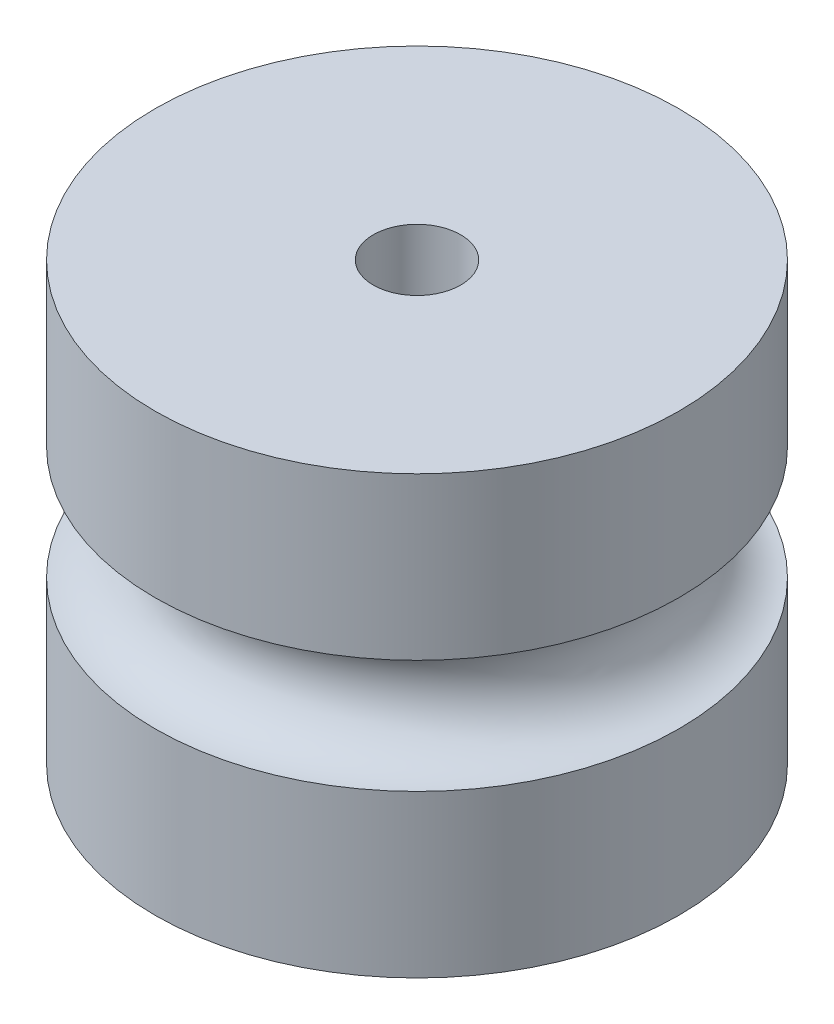
ISO-10303-21;
HEADER;
FILE_DESCRIPTION(('STEP AP214'),'2;1');
FILE_NAME('part.step','',(''),(''),'','','');
FILE_SCHEMA(('AUTOMOTIVE_DESIGN { 1 0 10303 214 1 1 1 1 }'));
ENDSEC;
DATA;
#1=APPLICATION_CONTEXT('core data for automotive mechanical design processes');
#2=APPLICATION_PROTOCOL_DEFINITION('international standard','automotive_design',2000,#1);
#3=PRODUCT_CONTEXT('',#1,'mechanical');
#4=PRODUCT('Part','Part','',(#3));
#5=PRODUCT_RELATED_PRODUCT_CATEGORY('part','',(#4));
#6=PRODUCT_DEFINITION_FORMATION('','',#4);
#7=PRODUCT_DEFINITION_CONTEXT('part definition',#1,'design');
#8=PRODUCT_DEFINITION('design','',#6,#7);
#9=PRODUCT_DEFINITION_SHAPE('','',#8);
#10=(LENGTH_UNIT() NAMED_UNIT(*) SI_UNIT(.MILLI.,.METRE.));
#11=(NAMED_UNIT(*) PLANE_ANGLE_UNIT() SI_UNIT($,.RADIAN.));
#12=(NAMED_UNIT(*) SI_UNIT($,.STERADIAN.) SOLID_ANGLE_UNIT());
#13=UNCERTAINTY_MEASURE_WITH_UNIT(LENGTH_MEASURE(1.E-05),#10,'distance_accuracy_value','');
#14=(GEOMETRIC_REPRESENTATION_CONTEXT(3) GLOBAL_UNCERTAINTY_ASSIGNED_CONTEXT((#13)) GLOBAL_UNIT_ASSIGNED_CONTEXT((#10,
#11,#12)) REPRESENTATION_CONTEXT('',''));
#15=CARTESIAN_POINT('',(0.,0.,0.));
#16=DIRECTION('',(0.,0.,1.));
#17=DIRECTION('',(1.,0.,0.));
#18=AXIS2_PLACEMENT_3D('',#15,#16,#17);
#19=CARTESIAN_POINT('',(0.,5.,0.));
#20=DIRECTION('',(0.,-1.,0.));
#21=DIRECTION('',(0.,0.,-1.));
#22=AXIS2_PLACEMENT_3D('',#19,#20,#21);
#23=CYLINDRICAL_SURFACE('',#22,3.);
#24=CARTESIAN_POINT('',(0.,1.85,0.));
#25=DIRECTION('',(0.,1.,0.));
#26=DIRECTION('',(0.,0.,1.));
#27=AXIS2_PLACEMENT_3D('',#24,#25,#26);
#28=CIRCLE('',#27,3.);
#29=CARTESIAN_POINT('',(0.,1.85,3.));
#30=VERTEX_POINT('',#29);
#31=EDGE_CURVE('E35',#30,#30,#28,.F.);
#32=ORIENTED_EDGE('',*,*,#31,.T.);
#33=EDGE_LOOP('',(#32));
#34=FACE_BOUND('',#33,.T.);
#35=CARTESIAN_POINT('',(0.,0.,0.));
#36=DIRECTION('',(0.,1.,0.));
#37=DIRECTION('',(0.,0.,1.));
#38=AXIS2_PLACEMENT_3D('',#35,#36,#37);
#39=CIRCLE('',#38,3.);
#40=CARTESIAN_POINT('',(0.,0.,3.));
#41=VERTEX_POINT('',#40);
#42=EDGE_CURVE('E39',#41,#41,#39,.T.);
#43=ORIENTED_EDGE('',*,*,#42,.T.);
#44=EDGE_LOOP('',(#43));
#45=FACE_BOUND('',#44,.T.);
#46=ADVANCED_FACE('F31',(#34,#45),#23,.T.);
#47=CARTESIAN_POINT('',(0.,5.,0.));
#48=DIRECTION('',(0.,1.,0.));
#49=DIRECTION('',(0.,0.,1.));
#50=AXIS2_PLACEMENT_3D('',#47,#48,#49);
#51=PLANE('',#50);
#52=CARTESIAN_POINT('',(0.,5.,0.));
#53=DIRECTION('',(0.,1.,0.));
#54=DIRECTION('',(0.,0.,1.));
#55=AXIS2_PLACEMENT_3D('',#52,#53,#54);
#56=CIRCLE('',#55,3.);
#57=CARTESIAN_POINT('',(0.,5.,3.));
#58=VERTEX_POINT('',#57);
#59=EDGE_CURVE('E10',#58,#58,#56,.T.);
#60=ORIENTED_EDGE('',*,*,#59,.T.);
#61=EDGE_LOOP('',(#60));
#62=FACE_BOUND('',#61,.T.);
#63=CARTESIAN_POINT('',(0.,5.,0.));
#64=DIRECTION('',(0.,1.,0.));
#65=DIRECTION('',(0.,0.,1.));
#66=AXIS2_PLACEMENT_3D('',#63,#64,#65);
#67=CIRCLE('',#66,0.5);
#68=CARTESIAN_POINT('',(0.,5.,0.5));
#69=VERTEX_POINT('',#68);
#70=EDGE_CURVE('E44',#69,#69,#67,.T.);
#71=ORIENTED_EDGE('',*,*,#70,.F.);
#72=EDGE_LOOP('',(#71));
#73=FACE_BOUND('',#72,.T.);
#74=ADVANCED_FACE('F65',(#62,#73),#51,.T.);
#75=CARTESIAN_POINT('',(0.,0.,0.));
#76=DIRECTION('',(0.,1.,0.));
#77=DIRECTION('',(0.,0.,1.));
#78=AXIS2_PLACEMENT_3D('',#75,#76,#77);
#79=PLANE('',#78);
#80=ORIENTED_EDGE('',*,*,#42,.F.);
#81=EDGE_LOOP('',(#80));
#82=FACE_BOUND('',#81,.T.);
#83=CARTESIAN_POINT('',(0.,0.,0.));
#84=DIRECTION('',(0.,1.,0.));
#85=DIRECTION('',(0.,0.,1.));
#86=AXIS2_PLACEMENT_3D('',#83,#84,#85);
#87=CIRCLE('',#86,0.5);
#88=CARTESIAN_POINT('',(0.,0.,0.5));
#89=VERTEX_POINT('',#88);
#90=EDGE_CURVE('E47',#89,#89,#87,.T.);
#91=ORIENTED_EDGE('',*,*,#90,.T.);
#92=EDGE_LOOP('',(#91));
#93=FACE_BOUND('',#92,.T.);
#94=ADVANCED_FACE('F67',(#82,#93),#79,.F.);
#95=CARTESIAN_POINT('',(0.,3.15,0.));
#96=DIRECTION('',(0.,-1.,0.));
#97=DIRECTION('',(0.,0.,-1.));
#98=AXIS2_PLACEMENT_3D('',#95,#96,#97);
#99=CIRCLE('',#98,3.);
#100=CARTESIAN_POINT('',(0.,3.15,-3.));
#101=VERTEX_POINT('',#100);
#102=EDGE_CURVE('E49',#101,#101,#99,.F.);
#103=ORIENTED_EDGE('',*,*,#102,.T.);
#104=EDGE_LOOP('',(#103));
#105=FACE_BOUND('',#104,.T.);
#106=ORIENTED_EDGE('',*,*,#59,.F.);
#107=EDGE_LOOP('',(#106));
#108=FACE_BOUND('',#107,.T.);
#109=ADVANCED_FACE('F33',(#105,#108),#23,.T.);
#110=CARTESIAN_POINT('',(0.,5.,0.));
#111=DIRECTION('',(0.,-1.,0.));
#112=DIRECTION('',(0.,0.,-1.));
#113=AXIS2_PLACEMENT_3D('',#110,#111,#112);
#114=CYLINDRICAL_SURFACE('',#113,0.5);
#115=ORIENTED_EDGE('',*,*,#70,.T.);
#116=EDGE_LOOP('',(#115));
#117=FACE_BOUND('',#116,.T.);
#118=ORIENTED_EDGE('',*,*,#90,.F.);
#119=EDGE_LOOP('',(#118));
#120=FACE_BOUND('',#119,.T.);
#121=ADVANCED_FACE('F62',(#117,#120),#114,.F.);
#122=CARTESIAN_POINT('',(0.,2.5,0.));
#123=DIRECTION('',(0.,-1.,0.));
#124=DIRECTION('',(0.,0.,-1.));
#125=AXIS2_PLACEMENT_3D('',#122,#123,#124);
#126=TOROIDAL_SURFACE('',#125,3.,0.65);
#127=ORIENTED_EDGE('',*,*,#102,.F.);
#128=EDGE_LOOP('',(#127));
#129=FACE_BOUND('',#128,.T.);
#130=ORIENTED_EDGE('',*,*,#31,.F.);
#131=EDGE_LOOP('',(#130));
#132=FACE_BOUND('',#131,.T.);
#133=ADVANCED_FACE('F77',(#129,#132),#126,.F.);
#134=CLOSED_SHELL('',(#46,#74,#94,#109,#121,#133));
#135=MANIFOLD_SOLID_BREP('B2',#134);
#136=ADVANCED_BREP_SHAPE_REPRESENTATION('',(#18,#135),#14);
#137=SHAPE_DEFINITION_REPRESENTATION(#9,#136);
ENDSEC;
END-ISO-10303-21;
